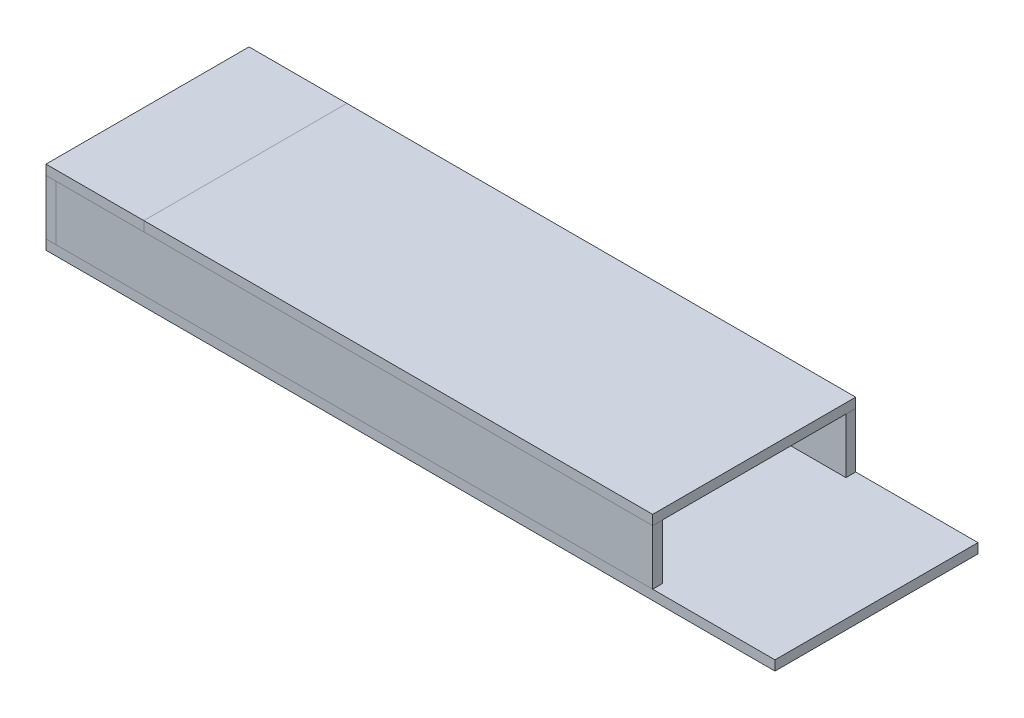
ISO-10303-21;
HEADER;
FILE_DESCRIPTION(('STEP AP214'),'2;1');
FILE_NAME('part.step','',(''),(''),'','','');
FILE_SCHEMA(('AUTOMOTIVE_DESIGN { 1 0 10303 214 1 1 1 1 }'));
ENDSEC;
DATA;
#1=APPLICATION_CONTEXT('core data for automotive mechanical design processes');
#2=APPLICATION_PROTOCOL_DEFINITION('international standard','automotive_design',2000,#1);
#3=PRODUCT_CONTEXT('',#1,'mechanical');
#4=PRODUCT('Part','Part','',(#3));
#5=PRODUCT_RELATED_PRODUCT_CATEGORY('part','',(#4));
#6=PRODUCT_DEFINITION_FORMATION('','',#4);
#7=PRODUCT_DEFINITION_CONTEXT('part definition',#1,'design');
#8=PRODUCT_DEFINITION('design','',#6,#7);
#9=PRODUCT_DEFINITION_SHAPE('','',#8);
#10=(LENGTH_UNIT() NAMED_UNIT(*) SI_UNIT(.MILLI.,.METRE.));
#11=(NAMED_UNIT(*) PLANE_ANGLE_UNIT() SI_UNIT($,.RADIAN.));
#12=(NAMED_UNIT(*) SI_UNIT($,.STERADIAN.) SOLID_ANGLE_UNIT());
#13=UNCERTAINTY_MEASURE_WITH_UNIT(LENGTH_MEASURE(1.E-05),#10,'distance_accuracy_value','');
#14=(GEOMETRIC_REPRESENTATION_CONTEXT(3) GLOBAL_UNCERTAINTY_ASSIGNED_CONTEXT((#13)) GLOBAL_UNIT_ASSIGNED_CONTEXT((#10,
#11,#12)) REPRESENTATION_CONTEXT('',''));
#15=CARTESIAN_POINT('',(0.,0.,0.));
#16=DIRECTION('',(0.,0.,1.));
#17=DIRECTION('',(1.,0.,0.));
#18=AXIS2_PLACEMENT_3D('',#15,#16,#17);
#19=CARTESIAN_POINT('',(-208.,61.,-82.9999999999999));
#20=DIRECTION('',(1.,0.,0.));
#21=DIRECTION('',(0.,0.,-1.));
#22=AXIS2_PLACEMENT_3D('',#19,#20,#21);
#23=PLANE('',#22);
#24=DIRECTION('',(0.,0.,1.));
#25=VECTOR('',#24,1.);
#26=CARTESIAN_POINT('',(-208.,53.,-82.9999999999999));
#27=LINE('',#26,#25);
#28=CARTESIAN_POINT('',(-208.,53.,-82.9999999999999));
#29=VERTEX_POINT('',#28);
#30=CARTESIAN_POINT('',(-208.,53.,83.));
#31=VERTEX_POINT('',#30);
#32=EDGE_CURVE('E116',#29,#31,#27,.T.);
#33=ORIENTED_EDGE('',*,*,#32,.T.);
#34=DIRECTION('',(0.,-1.,0.));
#35=VECTOR('',#34,1.);
#36=CARTESIAN_POINT('',(-208.,61.,83.));
#37=LINE('',#36,#35);
#38=CARTESIAN_POINT('',(-208.,61.,83.));
#39=VERTEX_POINT('',#38);
#40=EDGE_CURVE('E12',#39,#31,#37,.T.);
#41=ORIENTED_EDGE('',*,*,#40,.F.);
#42=DIRECTION('',(0.,0.,1.));
#43=VECTOR('',#42,1.);
#44=CARTESIAN_POINT('',(-208.,61.,-82.9999999999999));
#45=LINE('',#44,#43);
#46=CARTESIAN_POINT('',(-208.,61.,-82.9999999999999));
#47=VERTEX_POINT('',#46);
#48=EDGE_CURVE('E104',#47,#39,#45,.T.);
#49=ORIENTED_EDGE('',*,*,#48,.F.);
#50=DIRECTION('',(0.,-1.,0.));
#51=VECTOR('',#50,1.);
#52=CARTESIAN_POINT('',(-208.,61.,-82.9999999999999));
#53=LINE('',#52,#51);
#54=EDGE_CURVE('E112',#47,#29,#53,.T.);
#55=ORIENTED_EDGE('',*,*,#54,.T.);
#56=EDGE_LOOP('',(#33,#41,#49,#55));
#57=FACE_BOUND('',#56,.T.);
#58=ADVANCED_FACE('F53',(#57),#23,.F.);
#59=CARTESIAN_POINT('',(-208.,61.,83.));
#60=DIRECTION('',(0.,0.,-1.));
#61=DIRECTION('',(-1.,0.,0.));
#62=AXIS2_PLACEMENT_3D('',#59,#60,#61);
#63=PLANE('',#62);
#64=DIRECTION('',(1.,0.,0.));
#65=VECTOR('',#64,1.);
#66=CARTESIAN_POINT('',(-208.,53.,83.));
#67=LINE('',#66,#65);
#68=CARTESIAN_POINT('',(208.,53.,83.));
#69=VERTEX_POINT('',#68);
#70=EDGE_CURVE('E108',#31,#69,#67,.T.);
#71=ORIENTED_EDGE('',*,*,#70,.T.);
#72=DIRECTION('',(0.,-1.,0.));
#73=VECTOR('',#72,1.);
#74=CARTESIAN_POINT('',(208.,61.,83.));
#75=LINE('',#74,#73);
#76=CARTESIAN_POINT('',(208.,61.,83.));
#77=VERTEX_POINT('',#76);
#78=EDGE_CURVE('E61',#77,#69,#75,.T.);
#79=ORIENTED_EDGE('',*,*,#78,.F.);
#80=DIRECTION('',(1.,0.,0.));
#81=VECTOR('',#80,1.);
#82=CARTESIAN_POINT('',(-208.,61.,83.));
#83=LINE('',#82,#81);
#84=EDGE_CURVE('E99',#39,#77,#83,.T.);
#85=ORIENTED_EDGE('',*,*,#84,.F.);
#86=ORIENTED_EDGE('',*,*,#40,.T.);
#87=EDGE_LOOP('',(#71,#79,#85,#86));
#88=FACE_BOUND('',#87,.T.);
#89=ADVANCED_FACE('F107',(#88),#63,.F.);
#90=CARTESIAN_POINT('',(208.,61.,-82.9999999999999));
#91=DIRECTION('',(-1.,0.,0.));
#92=DIRECTION('',(0.,0.,1.));
#93=AXIS2_PLACEMENT_3D('',#90,#91,#92);
#94=PLANE('',#93);
#95=DIRECTION('',(0.,0.,-1.));
#96=VECTOR('',#95,1.);
#97=CARTESIAN_POINT('',(208.,53.,-82.9999999999999));
#98=LINE('',#97,#96);
#99=CARTESIAN_POINT('',(208.,53.,-82.9999999999999));
#100=VERTEX_POINT('',#99);
#101=EDGE_CURVE('E86',#69,#100,#98,.T.);
#102=ORIENTED_EDGE('',*,*,#101,.T.);
#103=DIRECTION('',(0.,-1.,0.));
#104=VECTOR('',#103,1.);
#105=CARTESIAN_POINT('',(208.,61.,-82.9999999999999));
#106=LINE('',#105,#104);
#107=CARTESIAN_POINT('',(208.,61.,-82.9999999999999));
#108=VERTEX_POINT('',#107);
#109=EDGE_CURVE('E109',#108,#100,#106,.T.);
#110=ORIENTED_EDGE('',*,*,#109,.F.);
#111=DIRECTION('',(0.,0.,-1.));
#112=VECTOR('',#111,1.);
#113=CARTESIAN_POINT('',(208.,61.,-82.9999999999999));
#114=LINE('',#113,#112);
#115=EDGE_CURVE('E102',#77,#108,#114,.T.);
#116=ORIENTED_EDGE('',*,*,#115,.F.);
#117=ORIENTED_EDGE('',*,*,#78,.T.);
#118=EDGE_LOOP('',(#102,#110,#116,#117));
#119=FACE_BOUND('',#118,.T.);
#120=ADVANCED_FACE('F110',(#119),#94,.F.);
#121=CARTESIAN_POINT('',(-208.,61.,-82.9999999999999));
#122=DIRECTION('',(0.,0.,1.));
#123=DIRECTION('',(1.,0.,0.));
#124=AXIS2_PLACEMENT_3D('',#121,#122,#123);
#125=PLANE('',#124);
#126=DIRECTION('',(-1.,0.,0.));
#127=VECTOR('',#126,1.);
#128=CARTESIAN_POINT('',(-208.,53.,-82.9999999999999));
#129=LINE('',#128,#127);
#130=EDGE_CURVE('E92',#100,#29,#129,.T.);
#131=ORIENTED_EDGE('',*,*,#130,.T.);
#132=ORIENTED_EDGE('',*,*,#54,.F.);
#133=DIRECTION('',(-1.,0.,0.));
#134=VECTOR('',#133,1.);
#135=CARTESIAN_POINT('',(-208.,61.,-82.9999999999999));
#136=LINE('',#135,#134);
#137=EDGE_CURVE('E69',#108,#47,#136,.T.);
#138=ORIENTED_EDGE('',*,*,#137,.F.);
#139=ORIENTED_EDGE('',*,*,#109,.T.);
#140=EDGE_LOOP('',(#131,#132,#138,#139));
#141=FACE_BOUND('',#140,.T.);
#142=ADVANCED_FACE('F123',(#141),#125,.F.);
#143=CARTESIAN_POINT('',(0.,61.,0.));
#144=DIRECTION('',(0.,1.,0.));
#145=DIRECTION('',(0.,0.,1.));
#146=AXIS2_PLACEMENT_3D('',#143,#144,#145);
#147=PLANE('',#146);
#148=ORIENTED_EDGE('',*,*,#48,.T.);
#149=ORIENTED_EDGE('',*,*,#84,.T.);
#150=ORIENTED_EDGE('',*,*,#115,.T.);
#151=ORIENTED_EDGE('',*,*,#137,.T.);
#152=EDGE_LOOP('',(#148,#149,#150,#151));
#153=FACE_BOUND('',#152,.T.);
#154=ADVANCED_FACE('F100',(#153),#147,.T.);
#155=CARTESIAN_POINT('',(0.,53.,0.));
#156=DIRECTION('',(0.,1.,0.));
#157=DIRECTION('',(0.,0.,1.));
#158=AXIS2_PLACEMENT_3D('',#155,#156,#157);
#159=PLANE('',#158);
#160=ORIENTED_EDGE('',*,*,#32,.F.);
#161=ORIENTED_EDGE('',*,*,#130,.F.);
#162=ORIENTED_EDGE('',*,*,#101,.F.);
#163=ORIENTED_EDGE('',*,*,#70,.F.);
#164=EDGE_LOOP('',(#160,#161,#162,#163));
#165=FACE_BOUND('',#164,.T.);
#166=ADVANCED_FACE('F126',(#165),#159,.F.);
#167=CLOSED_SHELL('',(#58,#89,#120,#142,#154,#166));
#168=MANIFOLD_SOLID_BREP('B2',#167);
#169=CARTESIAN_POINT('',(-288.,61.,-82.9999999999999));
#170=DIRECTION('',(1.,0.,0.));
#171=DIRECTION('',(0.,0.,-1.));
#172=AXIS2_PLACEMENT_3D('',#169,#170,#171);
#173=PLANE('',#172);
#174=DIRECTION('',(0.,0.,1.));
#175=VECTOR('',#174,1.);
#176=CARTESIAN_POINT('',(-288.,53.,-82.9999999999999));
#177=LINE('',#176,#175);
#178=CARTESIAN_POINT('',(-288.,53.,-82.9999999999999));
#179=VERTEX_POINT('',#178);
#180=CARTESIAN_POINT('',(-288.,53.,83.));
#181=VERTEX_POINT('',#180);
#182=EDGE_CURVE('E249',#179,#181,#177,.T.);
#183=ORIENTED_EDGE('',*,*,#182,.T.);
#184=DIRECTION('',(0.,-1.,0.));
#185=VECTOR('',#184,1.);
#186=CARTESIAN_POINT('',(-288.,61.,83.));
#187=LINE('',#186,#185);
#188=CARTESIAN_POINT('',(-288.,61.,83.));
#189=VERTEX_POINT('',#188);
#190=EDGE_CURVE('E51',#189,#181,#187,.T.);
#191=ORIENTED_EDGE('',*,*,#190,.F.);
#192=DIRECTION('',(0.,0.,1.));
#193=VECTOR('',#192,1.);
#194=CARTESIAN_POINT('',(-288.,61.,-82.9999999999999));
#195=LINE('',#194,#193);
#196=CARTESIAN_POINT('',(-288.,61.,-82.9999999999999));
#197=VERTEX_POINT('',#196);
#198=EDGE_CURVE('E237',#197,#189,#195,.T.);
#199=ORIENTED_EDGE('',*,*,#198,.F.);
#200=DIRECTION('',(0.,-1.,0.));
#201=VECTOR('',#200,1.);
#202=CARTESIAN_POINT('',(-288.,61.,-82.9999999999999));
#203=LINE('',#202,#201);
#204=EDGE_CURVE('E245',#197,#179,#203,.T.);
#205=ORIENTED_EDGE('',*,*,#204,.T.);
#206=EDGE_LOOP('',(#183,#191,#199,#205));
#207=FACE_BOUND('',#206,.T.);
#208=ADVANCED_FACE('F186',(#207),#173,.F.);
#209=CARTESIAN_POINT('',(-288.,61.,83.));
#210=DIRECTION('',(0.,0.,-1.));
#211=DIRECTION('',(-1.,0.,0.));
#212=AXIS2_PLACEMENT_3D('',#209,#210,#211);
#213=PLANE('',#212);
#214=DIRECTION('',(1.,0.,0.));
#215=VECTOR('',#214,1.);
#216=CARTESIAN_POINT('',(-288.,53.,83.));
#217=LINE('',#216,#215);
#218=CARTESIAN_POINT('',(-208.,53.,83.0000000000001));
#219=VERTEX_POINT('',#218);
#220=EDGE_CURVE('E241',#181,#219,#217,.T.);
#221=ORIENTED_EDGE('',*,*,#220,.T.);
#222=DIRECTION('',(0.,-1.,0.));
#223=VECTOR('',#222,1.);
#224=CARTESIAN_POINT('',(-208.,61.,83.0000000000001));
#225=LINE('',#224,#223);
#226=CARTESIAN_POINT('',(-208.,61.,83.0000000000001));
#227=VERTEX_POINT('',#226);
#228=EDGE_CURVE('E194',#227,#219,#225,.T.);
#229=ORIENTED_EDGE('',*,*,#228,.F.);
#230=DIRECTION('',(1.,0.,0.));
#231=VECTOR('',#230,1.);
#232=CARTESIAN_POINT('',(-288.,61.,83.));
#233=LINE('',#232,#231);
#234=EDGE_CURVE('E232',#189,#227,#233,.T.);
#235=ORIENTED_EDGE('',*,*,#234,.F.);
#236=ORIENTED_EDGE('',*,*,#190,.T.);
#237=EDGE_LOOP('',(#221,#229,#235,#236));
#238=FACE_BOUND('',#237,.T.);
#239=ADVANCED_FACE('F240',(#238),#213,.F.);
#240=CARTESIAN_POINT('',(-208.,61.,-82.9999999999999));
#241=DIRECTION('',(-1.,0.,0.));
#242=DIRECTION('',(0.,0.,1.));
#243=AXIS2_PLACEMENT_3D('',#240,#241,#242);
#244=PLANE('',#243);
#245=DIRECTION('',(0.,0.,-1.));
#246=VECTOR('',#245,1.);
#247=CARTESIAN_POINT('',(-208.,53.,-82.9999999999999));
#248=LINE('',#247,#246);
#249=CARTESIAN_POINT('',(-208.,53.,-82.9999999999999));
#250=VERTEX_POINT('',#249);
#251=EDGE_CURVE('E219',#219,#250,#248,.T.);
#252=ORIENTED_EDGE('',*,*,#251,.T.);
#253=DIRECTION('',(0.,-1.,0.));
#254=VECTOR('',#253,1.);
#255=CARTESIAN_POINT('',(-208.,61.,-82.9999999999999));
#256=LINE('',#255,#254);
#257=CARTESIAN_POINT('',(-208.,61.,-82.9999999999999));
#258=VERTEX_POINT('',#257);
#259=EDGE_CURVE('E242',#258,#250,#256,.T.);
#260=ORIENTED_EDGE('',*,*,#259,.F.);
#261=DIRECTION('',(0.,0.,-1.));
#262=VECTOR('',#261,1.);
#263=CARTESIAN_POINT('',(-208.,61.,-82.9999999999999));
#264=LINE('',#263,#262);
#265=EDGE_CURVE('E235',#227,#258,#264,.T.);
#266=ORIENTED_EDGE('',*,*,#265,.F.);
#267=ORIENTED_EDGE('',*,*,#228,.T.);
#268=EDGE_LOOP('',(#252,#260,#266,#267));
#269=FACE_BOUND('',#268,.T.);
#270=ADVANCED_FACE('F243',(#269),#244,.F.);
#271=CARTESIAN_POINT('',(-288.,61.,-82.9999999999999));
#272=DIRECTION('',(0.,0.,1.));
#273=DIRECTION('',(1.,0.,0.));
#274=AXIS2_PLACEMENT_3D('',#271,#272,#273);
#275=PLANE('',#274);
#276=DIRECTION('',(-1.,0.,0.));
#277=VECTOR('',#276,1.);
#278=CARTESIAN_POINT('',(-288.,53.,-82.9999999999999));
#279=LINE('',#278,#277);
#280=EDGE_CURVE('E225',#250,#179,#279,.T.);
#281=ORIENTED_EDGE('',*,*,#280,.T.);
#282=ORIENTED_EDGE('',*,*,#204,.F.);
#283=DIRECTION('',(-1.,0.,0.));
#284=VECTOR('',#283,1.);
#285=CARTESIAN_POINT('',(-288.,61.,-82.9999999999999));
#286=LINE('',#285,#284);
#287=EDGE_CURVE('E202',#258,#197,#286,.T.);
#288=ORIENTED_EDGE('',*,*,#287,.F.);
#289=ORIENTED_EDGE('',*,*,#259,.T.);
#290=EDGE_LOOP('',(#281,#282,#288,#289));
#291=FACE_BOUND('',#290,.T.);
#292=ADVANCED_FACE('F256',(#291),#275,.F.);
#293=CARTESIAN_POINT('',(0.,61.,0.));
#294=DIRECTION('',(0.,1.,0.));
#295=DIRECTION('',(0.,0.,1.));
#296=AXIS2_PLACEMENT_3D('',#293,#294,#295);
#297=PLANE('',#296);
#298=ORIENTED_EDGE('',*,*,#198,.T.);
#299=ORIENTED_EDGE('',*,*,#234,.T.);
#300=ORIENTED_EDGE('',*,*,#265,.T.);
#301=ORIENTED_EDGE('',*,*,#287,.T.);
#302=EDGE_LOOP('',(#298,#299,#300,#301));
#303=FACE_BOUND('',#302,.T.);
#304=ADVANCED_FACE('F233',(#303),#297,.T.);
#305=CARTESIAN_POINT('',(0.,53.,0.));
#306=DIRECTION('',(0.,1.,0.));
#307=DIRECTION('',(0.,0.,1.));
#308=AXIS2_PLACEMENT_3D('',#305,#306,#307);
#309=PLANE('',#308);
#310=ORIENTED_EDGE('',*,*,#182,.F.);
#311=ORIENTED_EDGE('',*,*,#280,.F.);
#312=ORIENTED_EDGE('',*,*,#251,.F.);
#313=ORIENTED_EDGE('',*,*,#220,.F.);
#314=EDGE_LOOP('',(#310,#311,#312,#313));
#315=FACE_BOUND('',#314,.T.);
#316=ADVANCED_FACE('F259',(#315),#309,.F.);
#317=CLOSED_SHELL('',(#208,#239,#270,#292,#304,#316));
#318=MANIFOLD_SOLID_BREP('B6',#317);
#319=CARTESIAN_POINT('',(-280.,53.,75.));
#320=DIRECTION('',(1.,0.,0.));
#321=DIRECTION('',(0.,0.,-1.));
#322=AXIS2_PLACEMENT_3D('',#319,#320,#321);
#323=PLANE('',#322);
#324=DIRECTION('',(0.,0.,-1.));
#325=VECTOR('',#324,1.);
#326=CARTESIAN_POINT('',(-280.,53.,0.));
#327=LINE('',#326,#325);
#328=CARTESIAN_POINT('',(-280.,53.,-75.));
#329=VERTEX_POINT('',#328);
#330=CARTESIAN_POINT('',(-280.,53.,-82.9999999999999));
#331=VERTEX_POINT('',#330);
#332=EDGE_CURVE('E184',#329,#331,#327,.T.);
#333=ORIENTED_EDGE('',*,*,#332,.T.);
#334=DIRECTION('',(0.,1.,0.));
#335=VECTOR('',#334,1.);
#336=CARTESIAN_POINT('',(-280.,237.271538768199,-82.9999999999999));
#337=LINE('',#336,#335);
#338=CARTESIAN_POINT('',(-280.,8.,-82.9999999999999));
#339=VERTEX_POINT('',#338);
#340=EDGE_CURVE('E327',#339,#331,#337,.T.);
#341=ORIENTED_EDGE('',*,*,#340,.F.);
#342=DIRECTION('',(0.,0.,-1.));
#343=VECTOR('',#342,1.);
#344=CARTESIAN_POINT('',(-280.,8.,0.));
#345=LINE('',#344,#343);
#346=CARTESIAN_POINT('',(-280.,8.,-75.));
#347=VERTEX_POINT('',#346);
#348=EDGE_CURVE('E322',#347,#339,#345,.T.);
#349=ORIENTED_EDGE('',*,*,#348,.F.);
#350=DIRECTION('',(0.,-1.,0.));
#351=VECTOR('',#350,1.);
#352=CARTESIAN_POINT('',(-280.,237.271538768199,-75.));
#353=LINE('',#352,#351);
#354=EDGE_CURVE('E381',#329,#347,#353,.T.);
#355=ORIENTED_EDGE('',*,*,#354,.F.);
#356=EDGE_LOOP('',(#333,#341,#349,#355));
#357=FACE_BOUND('',#356,.T.);
#358=ADVANCED_FACE('F319',(#357),#323,.F.);
#359=CARTESIAN_POINT('',(-288.,237.271538768199,-82.9999999999999));
#360=DIRECTION('',(0.,0.,1.));
#361=DIRECTION('',(1.,0.,0.));
#362=AXIS2_PLACEMENT_3D('',#359,#360,#361);
#363=PLANE('',#362);
#364=DIRECTION('',(-1.,0.,0.));
#365=VECTOR('',#364,1.);
#366=CARTESIAN_POINT('',(-288.,8.,-82.9999999999999));
#367=LINE('',#366,#365);
#368=CARTESIAN_POINT('',(208.,8.,-83.));
#369=VERTEX_POINT('',#368);
#370=EDGE_CURVE('E367',#369,#339,#367,.T.);
#371=ORIENTED_EDGE('',*,*,#370,.T.);
#372=ORIENTED_EDGE('',*,*,#340,.T.);
#373=DIRECTION('',(-1.,0.,0.));
#374=VECTOR('',#373,1.);
#375=CARTESIAN_POINT('',(-288.,53.,-82.9999999999999));
#376=LINE('',#375,#374);
#377=CARTESIAN_POINT('',(208.,53.,-83.));
#378=VERTEX_POINT('',#377);
#379=EDGE_CURVE('E358',#378,#331,#376,.T.);
#380=ORIENTED_EDGE('',*,*,#379,.F.);
#381=DIRECTION('',(0.,-1.,0.));
#382=VECTOR('',#381,1.);
#383=CARTESIAN_POINT('',(208.,53.,-83.));
#384=LINE('',#383,#382);
#385=EDGE_CURVE('E362',#378,#369,#384,.T.);
#386=ORIENTED_EDGE('',*,*,#385,.T.);
#387=EDGE_LOOP('',(#371,#372,#380,#386));
#388=FACE_BOUND('',#387,.T.);
#389=ADVANCED_FACE('F360',(#388),#363,.F.);
#390=CARTESIAN_POINT('',(-280.,237.271538768199,-75.));
#391=DIRECTION('',(0.,0.,-1.));
#392=DIRECTION('',(-1.,0.,0.));
#393=AXIS2_PLACEMENT_3D('',#390,#391,#392);
#394=PLANE('',#393);
#395=DIRECTION('',(1.,0.,0.));
#396=VECTOR('',#395,1.);
#397=CARTESIAN_POINT('',(-280.,53.,-75.));
#398=LINE('',#397,#396);
#399=CARTESIAN_POINT('',(208.,53.,-75.));
#400=VERTEX_POINT('',#399);
#401=EDGE_CURVE('E366',#329,#400,#398,.T.);
#402=ORIENTED_EDGE('',*,*,#401,.F.);
#403=ORIENTED_EDGE('',*,*,#354,.T.);
#404=DIRECTION('',(1.,0.,0.));
#405=VECTOR('',#404,1.);
#406=CARTESIAN_POINT('',(-280.,8.,-75.));
#407=LINE('',#406,#405);
#408=CARTESIAN_POINT('',(208.,8.,-75.));
#409=VERTEX_POINT('',#408);
#410=EDGE_CURVE('E383',#347,#409,#407,.T.);
#411=ORIENTED_EDGE('',*,*,#410,.T.);
#412=DIRECTION('',(0.,-1.,0.));
#413=VECTOR('',#412,1.);
#414=CARTESIAN_POINT('',(208.,53.,-75.));
#415=LINE('',#414,#413);
#416=EDGE_CURVE('E376',#400,#409,#415,.T.);
#417=ORIENTED_EDGE('',*,*,#416,.F.);
#418=EDGE_LOOP('',(#402,#403,#411,#417));
#419=FACE_BOUND('',#418,.T.);
#420=ADVANCED_FACE('F391',(#419),#394,.F.);
#421=CARTESIAN_POINT('',(0.,53.,0.));
#422=DIRECTION('',(0.,1.,0.));
#423=DIRECTION('',(0.,0.,1.));
#424=AXIS2_PLACEMENT_3D('',#421,#422,#423);
#425=PLANE('',#424);
#426=ORIENTED_EDGE('',*,*,#332,.F.);
#427=ORIENTED_EDGE('',*,*,#401,.T.);
#428=DIRECTION('',(0.,0.,-1.));
#429=VECTOR('',#428,1.);
#430=CARTESIAN_POINT('',(208.,53.,-83.));
#431=LINE('',#430,#429);
#432=EDGE_CURVE('E370',#400,#378,#431,.T.);
#433=ORIENTED_EDGE('',*,*,#432,.T.);
#434=ORIENTED_EDGE('',*,*,#379,.T.);
#435=EDGE_LOOP('',(#426,#427,#433,#434));
#436=FACE_BOUND('',#435,.T.);
#437=ADVANCED_FACE('F371',(#436),#425,.T.);
#438=CARTESIAN_POINT('',(0.,8.,0.));
#439=DIRECTION('',(0.,1.,0.));
#440=DIRECTION('',(0.,0.,1.));
#441=AXIS2_PLACEMENT_3D('',#438,#439,#440);
#442=PLANE('',#441);
#443=ORIENTED_EDGE('',*,*,#410,.F.);
#444=ORIENTED_EDGE('',*,*,#348,.T.);
#445=ORIENTED_EDGE('',*,*,#370,.F.);
#446=DIRECTION('',(0.,0.,-1.));
#447=VECTOR('',#446,1.);
#448=CARTESIAN_POINT('',(208.,8.,-83.));
#449=LINE('',#448,#447);
#450=EDGE_CURVE('E377',#409,#369,#449,.T.);
#451=ORIENTED_EDGE('',*,*,#450,.F.);
#452=EDGE_LOOP('',(#443,#444,#445,#451));
#453=FACE_BOUND('',#452,.T.);
#454=ADVANCED_FACE('F392',(#453),#442,.F.);
#455=CARTESIAN_POINT('',(208.,53.,-83.));
#456=DIRECTION('',(-1.,0.,0.));
#457=DIRECTION('',(0.,0.,1.));
#458=AXIS2_PLACEMENT_3D('',#455,#456,#457);
#459=PLANE('',#458);
#460=ORIENTED_EDGE('',*,*,#450,.T.);
#461=ORIENTED_EDGE('',*,*,#385,.F.);
#462=ORIENTED_EDGE('',*,*,#432,.F.);
#463=ORIENTED_EDGE('',*,*,#416,.T.);
#464=EDGE_LOOP('',(#460,#461,#462,#463));
#465=FACE_BOUND('',#464,.T.);
#466=ADVANCED_FACE('F379',(#465),#459,.F.);
#467=CLOSED_SHELL('',(#358,#389,#420,#437,#454,#466));
#468=MANIFOLD_SOLID_BREP('B45',#467);
#469=CARTESIAN_POINT('',(-280.,53.,75.));
#470=DIRECTION('',(1.,0.,0.));
#471=DIRECTION('',(0.,0.,-1.));
#472=AXIS2_PLACEMENT_3D('',#469,#470,#471);
#473=PLANE('',#472);
#474=DIRECTION('',(0.,-1.,0.));
#475=VECTOR('',#474,1.);
#476=CARTESIAN_POINT('',(-280.,237.271538768199,75.));
#477=LINE('',#476,#475);
#478=CARTESIAN_POINT('',(-280.,53.,75.));
#479=VERTEX_POINT('',#478);
#480=CARTESIAN_POINT('',(-280.,8.,75.));
#481=VERTEX_POINT('',#480);
#482=EDGE_CURVE('E473',#479,#481,#477,.T.);
#483=ORIENTED_EDGE('',*,*,#482,.T.);
#484=DIRECTION('',(0.,0.,-1.));
#485=VECTOR('',#484,1.);
#486=CARTESIAN_POINT('',(-280.,8.,0.));
#487=LINE('',#486,#485);
#488=CARTESIAN_POINT('',(-280.,8.,83.0000000000001));
#489=VERTEX_POINT('',#488);
#490=EDGE_CURVE('E520',#489,#481,#487,.T.);
#491=ORIENTED_EDGE('',*,*,#490,.F.);
#492=DIRECTION('',(0.,-1.,0.));
#493=VECTOR('',#492,1.);
#494=CARTESIAN_POINT('',(-280.,237.271538768199,83.0000000000001));
#495=LINE('',#494,#493);
#496=CARTESIAN_POINT('',(-280.,53.,83.0000000000001));
#497=VERTEX_POINT('',#496);
#498=EDGE_CURVE('E485',#497,#489,#495,.T.);
#499=ORIENTED_EDGE('',*,*,#498,.F.);
#500=DIRECTION('',(0.,0.,-1.));
#501=VECTOR('',#500,1.);
#502=CARTESIAN_POINT('',(-280.,53.,0.));
#503=LINE('',#502,#501);
#504=EDGE_CURVE('E493',#497,#479,#503,.T.);
#505=ORIENTED_EDGE('',*,*,#504,.T.);
#506=EDGE_LOOP('',(#483,#491,#499,#505));
#507=FACE_BOUND('',#506,.T.);
#508=ADVANCED_FACE('F469',(#507),#473,.F.);
#509=CARTESIAN_POINT('',(0.,8.,0.));
#510=DIRECTION('',(0.,1.,0.));
#511=DIRECTION('',(0.,0.,1.));
#512=AXIS2_PLACEMENT_3D('',#509,#510,#511);
#513=PLANE('',#512);
#514=DIRECTION('',(1.,0.,0.));
#515=VECTOR('',#514,1.);
#516=CARTESIAN_POINT('',(-288.,8.,83.0000000000001));
#517=LINE('',#516,#515);
#518=CARTESIAN_POINT('',(208.,8.,83.));
#519=VERTEX_POINT('',#518);
#520=EDGE_CURVE('E317',#489,#519,#517,.T.);
#521=ORIENTED_EDGE('',*,*,#520,.F.);
#522=ORIENTED_EDGE('',*,*,#490,.T.);
#523=DIRECTION('',(-1.,0.,0.));
#524=VECTOR('',#523,1.);
#525=CARTESIAN_POINT('',(-280.,8.,75.));
#526=LINE('',#525,#524);
#527=CARTESIAN_POINT('',(208.,8.,75.));
#528=VERTEX_POINT('',#527);
#529=EDGE_CURVE('E478',#528,#481,#526,.T.);
#530=ORIENTED_EDGE('',*,*,#529,.F.);
#531=DIRECTION('',(0.,0.,-1.));
#532=VECTOR('',#531,1.);
#533=CARTESIAN_POINT('',(208.,8.,83.));
#534=LINE('',#533,#532);
#535=EDGE_CURVE('E528',#519,#528,#534,.T.);
#536=ORIENTED_EDGE('',*,*,#535,.F.);
#537=EDGE_LOOP('',(#521,#522,#530,#536));
#538=FACE_BOUND('',#537,.T.);
#539=ADVANCED_FACE('F543',(#538),#513,.F.);
#540=CARTESIAN_POINT('',(0.,53.,0.));
#541=DIRECTION('',(0.,1.,0.));
#542=DIRECTION('',(0.,0.,1.));
#543=AXIS2_PLACEMENT_3D('',#540,#541,#542);
#544=PLANE('',#543);
#545=ORIENTED_EDGE('',*,*,#504,.F.);
#546=DIRECTION('',(1.,0.,0.));
#547=VECTOR('',#546,1.);
#548=CARTESIAN_POINT('',(-288.,53.,83.0000000000001));
#549=LINE('',#548,#547);
#550=CARTESIAN_POINT('',(208.,53.,83.));
#551=VERTEX_POINT('',#550);
#552=EDGE_CURVE('E519',#497,#551,#549,.T.);
#553=ORIENTED_EDGE('',*,*,#552,.T.);
#554=DIRECTION('',(0.,0.,-1.));
#555=VECTOR('',#554,1.);
#556=CARTESIAN_POINT('',(208.,53.,83.));
#557=LINE('',#556,#555);
#558=CARTESIAN_POINT('',(208.,53.,75.));
#559=VERTEX_POINT('',#558);
#560=EDGE_CURVE('E523',#551,#559,#557,.T.);
#561=ORIENTED_EDGE('',*,*,#560,.T.);
#562=DIRECTION('',(-1.,0.,0.));
#563=VECTOR('',#562,1.);
#564=CARTESIAN_POINT('',(-280.,53.,75.));
#565=LINE('',#564,#563);
#566=EDGE_CURVE('E511',#559,#479,#565,.T.);
#567=ORIENTED_EDGE('',*,*,#566,.T.);
#568=EDGE_LOOP('',(#545,#553,#561,#567));
#569=FACE_BOUND('',#568,.T.);
#570=ADVANCED_FACE('F471',(#569),#544,.T.);
#571=CARTESIAN_POINT('',(-288.,237.271538768199,83.0000000000001));
#572=DIRECTION('',(0.,0.,-1.));
#573=DIRECTION('',(-1.,0.,0.));
#574=AXIS2_PLACEMENT_3D('',#571,#572,#573);
#575=PLANE('',#574);
#576=ORIENTED_EDGE('',*,*,#552,.F.);
#577=ORIENTED_EDGE('',*,*,#498,.T.);
#578=ORIENTED_EDGE('',*,*,#520,.T.);
#579=DIRECTION('',(0.,-1.,0.));
#580=VECTOR('',#579,1.);
#581=CARTESIAN_POINT('',(208.,53.,83.));
#582=LINE('',#581,#580);
#583=EDGE_CURVE('E527',#551,#519,#582,.T.);
#584=ORIENTED_EDGE('',*,*,#583,.F.);
#585=EDGE_LOOP('',(#576,#577,#578,#584));
#586=FACE_BOUND('',#585,.T.);
#587=ADVANCED_FACE('F541',(#586),#575,.F.);
#588=CARTESIAN_POINT('',(-280.,237.271538768199,75.));
#589=DIRECTION('',(0.,0.,1.));
#590=DIRECTION('',(1.,0.,0.));
#591=AXIS2_PLACEMENT_3D('',#588,#589,#590);
#592=PLANE('',#591);
#593=ORIENTED_EDGE('',*,*,#566,.F.);
#594=DIRECTION('',(0.,-1.,0.));
#595=VECTOR('',#594,1.);
#596=CARTESIAN_POINT('',(208.,53.,75.));
#597=LINE('',#596,#595);
#598=EDGE_CURVE('E516',#559,#528,#597,.T.);
#599=ORIENTED_EDGE('',*,*,#598,.T.);
#600=ORIENTED_EDGE('',*,*,#529,.T.);
#601=ORIENTED_EDGE('',*,*,#482,.F.);
#602=EDGE_LOOP('',(#593,#599,#600,#601));
#603=FACE_BOUND('',#602,.T.);
#604=ADVANCED_FACE('F513',(#603),#592,.F.);
#605=CARTESIAN_POINT('',(208.,53.,83.));
#606=DIRECTION('',(-1.,0.,0.));
#607=DIRECTION('',(0.,0.,1.));
#608=AXIS2_PLACEMENT_3D('',#605,#606,#607);
#609=PLANE('',#608);
#610=ORIENTED_EDGE('',*,*,#535,.T.);
#611=ORIENTED_EDGE('',*,*,#598,.F.);
#612=ORIENTED_EDGE('',*,*,#560,.F.);
#613=ORIENTED_EDGE('',*,*,#583,.T.);
#614=EDGE_LOOP('',(#610,#611,#612,#613));
#615=FACE_BOUND('',#614,.T.);
#616=ADVANCED_FACE('F530',(#615),#609,.F.);
#617=CLOSED_SHELL('',(#508,#539,#570,#587,#604,#616));
#618=MANIFOLD_SOLID_BREP('B178',#617);
#619=CARTESIAN_POINT('',(-280.,53.,75.));
#620=DIRECTION('',(1.,0.,0.));
#621=DIRECTION('',(0.,0.,-1.));
#622=AXIS2_PLACEMENT_3D('',#619,#620,#621);
#623=PLANE('',#622);
#624=DIRECTION('',(0.,-1.,0.));
#625=VECTOR('',#624,1.);
#626=CARTESIAN_POINT('',(-280.,237.271538768199,83.0000000000001));
#627=LINE('',#626,#625);
#628=CARTESIAN_POINT('',(-280.,53.,83.0000000000001));
#629=VERTEX_POINT('',#628);
#630=CARTESIAN_POINT('',(-280.,8.,83.0000000000001));
#631=VERTEX_POINT('',#630);
#632=EDGE_CURVE('E623',#629,#631,#627,.T.);
#633=ORIENTED_EDGE('',*,*,#632,.T.);
#634=DIRECTION('',(0.,0.,-1.));
#635=VECTOR('',#634,1.);
#636=CARTESIAN_POINT('',(-280.,8.,-75.));
#637=LINE('',#636,#635);
#638=CARTESIAN_POINT('',(-280.,8.,-82.9999999999999));
#639=VERTEX_POINT('',#638);
#640=EDGE_CURVE('E659',#631,#639,#637,.T.);
#641=ORIENTED_EDGE('',*,*,#640,.T.);
#642=DIRECTION('',(0.,1.,0.));
#643=VECTOR('',#642,1.);
#644=CARTESIAN_POINT('',(-280.,237.271538768199,-82.9999999999999));
#645=LINE('',#644,#643);
#646=CARTESIAN_POINT('',(-280.,53.,-82.9999999999999));
#647=VERTEX_POINT('',#646);
#648=EDGE_CURVE('E660',#639,#647,#645,.T.);
#649=ORIENTED_EDGE('',*,*,#648,.T.);
#650=DIRECTION('',(0.,0.,-1.));
#651=VECTOR('',#650,1.);
#652=CARTESIAN_POINT('',(-280.,53.,-75.));
#653=LINE('',#652,#651);
#654=EDGE_CURVE('E675',#629,#647,#653,.T.);
#655=ORIENTED_EDGE('',*,*,#654,.F.);
#656=EDGE_LOOP('',(#633,#641,#649,#655));
#657=FACE_BOUND('',#656,.T.);
#658=ADVANCED_FACE('F619',(#657),#623,.T.);
#659=CARTESIAN_POINT('',(-288.,237.271538768199,83.0000000000001));
#660=DIRECTION('',(1.,0.,0.));
#661=DIRECTION('',(0.,0.,-1.));
#662=AXIS2_PLACEMENT_3D('',#659,#660,#661);
#663=PLANE('',#662);
#664=DIRECTION('',(0.,0.,1.));
#665=VECTOR('',#664,1.);
#666=CARTESIAN_POINT('',(-288.,53.,83.0000000000001));
#667=LINE('',#666,#665);
#668=CARTESIAN_POINT('',(-288.,53.,-82.9999999999999));
#669=VERTEX_POINT('',#668);
#670=CARTESIAN_POINT('',(-288.,53.,83.0000000000001));
#671=VERTEX_POINT('',#670);
#672=EDGE_CURVE('E678',#669,#671,#667,.T.);
#673=ORIENTED_EDGE('',*,*,#672,.F.);
#674=DIRECTION('',(0.,-1.,0.));
#675=VECTOR('',#674,1.);
#676=CARTESIAN_POINT('',(-288.,237.271538768199,-82.9999999999999));
#677=LINE('',#676,#675);
#678=CARTESIAN_POINT('',(-288.,8.,-82.9999999999999));
#679=VERTEX_POINT('',#678);
#680=EDGE_CURVE('E467',#669,#679,#677,.T.);
#681=ORIENTED_EDGE('',*,*,#680,.T.);
#682=DIRECTION('',(0.,0.,1.));
#683=VECTOR('',#682,1.);
#684=CARTESIAN_POINT('',(-288.,8.,83.0000000000001));
#685=LINE('',#684,#683);
#686=CARTESIAN_POINT('',(-288.,8.,83.0000000000001));
#687=VERTEX_POINT('',#686);
#688=EDGE_CURVE('E629',#679,#687,#685,.T.);
#689=ORIENTED_EDGE('',*,*,#688,.T.);
#690=DIRECTION('',(0.,-1.,0.));
#691=VECTOR('',#690,1.);
#692=CARTESIAN_POINT('',(-288.,237.271538768199,83.0000000000001));
#693=LINE('',#692,#691);
#694=EDGE_CURVE('E680',#671,#687,#693,.T.);
#695=ORIENTED_EDGE('',*,*,#694,.F.);
#696=EDGE_LOOP('',(#673,#681,#689,#695));
#697=FACE_BOUND('',#696,.T.);
#698=ADVANCED_FACE('F692',(#697),#663,.F.);
#699=CARTESIAN_POINT('',(-288.,237.271538768199,-82.9999999999999));
#700=DIRECTION('',(0.,0.,1.));
#701=DIRECTION('',(1.,0.,0.));
#702=AXIS2_PLACEMENT_3D('',#699,#700,#701);
#703=PLANE('',#702);
#704=ORIENTED_EDGE('',*,*,#648,.F.);
#705=DIRECTION('',(-1.,0.,0.));
#706=VECTOR('',#705,1.);
#707=CARTESIAN_POINT('',(-288.,8.,-82.9999999999999));
#708=LINE('',#707,#706);
#709=EDGE_CURVE('E636',#639,#679,#708,.T.);
#710=ORIENTED_EDGE('',*,*,#709,.T.);
#711=ORIENTED_EDGE('',*,*,#680,.F.);
#712=DIRECTION('',(-1.,0.,0.));
#713=VECTOR('',#712,1.);
#714=CARTESIAN_POINT('',(-288.,53.,-82.9999999999999));
#715=LINE('',#714,#713);
#716=EDGE_CURVE('E671',#647,#669,#715,.T.);
#717=ORIENTED_EDGE('',*,*,#716,.F.);
#718=EDGE_LOOP('',(#704,#710,#711,#717));
#719=FACE_BOUND('',#718,.T.);
#720=ADVANCED_FACE('F673',(#719),#703,.F.);
#721=CARTESIAN_POINT('',(-288.,237.271538768199,83.0000000000001));
#722=DIRECTION('',(0.,0.,-1.));
#723=DIRECTION('',(-1.,0.,0.));
#724=AXIS2_PLACEMENT_3D('',#721,#722,#723);
#725=PLANE('',#724);
#726=ORIENTED_EDGE('',*,*,#632,.F.);
#727=DIRECTION('',(1.,0.,0.));
#728=VECTOR('',#727,1.);
#729=CARTESIAN_POINT('',(-288.,53.,83.0000000000001));
#730=LINE('',#729,#728);
#731=EDGE_CURVE('E681',#671,#629,#730,.T.);
#732=ORIENTED_EDGE('',*,*,#731,.F.);
#733=ORIENTED_EDGE('',*,*,#694,.T.);
#734=DIRECTION('',(1.,0.,0.));
#735=VECTOR('',#734,1.);
#736=CARTESIAN_POINT('',(-288.,8.,83.0000000000001));
#737=LINE('',#736,#735);
#738=EDGE_CURVE('E666',#687,#631,#737,.T.);
#739=ORIENTED_EDGE('',*,*,#738,.T.);
#740=EDGE_LOOP('',(#726,#732,#733,#739));
#741=FACE_BOUND('',#740,.T.);
#742=ADVANCED_FACE('F621',(#741),#725,.F.);
#743=CARTESIAN_POINT('',(0.,53.,0.));
#744=DIRECTION('',(0.,1.,0.));
#745=DIRECTION('',(0.,0.,1.));
#746=AXIS2_PLACEMENT_3D('',#743,#744,#745);
#747=PLANE('',#746);
#748=ORIENTED_EDGE('',*,*,#731,.T.);
#749=ORIENTED_EDGE('',*,*,#654,.T.);
#750=ORIENTED_EDGE('',*,*,#716,.T.);
#751=ORIENTED_EDGE('',*,*,#672,.T.);
#752=EDGE_LOOP('',(#748,#749,#750,#751));
#753=FACE_BOUND('',#752,.T.);
#754=ADVANCED_FACE('F693',(#753),#747,.T.);
#755=CARTESIAN_POINT('',(0.,8.,0.));
#756=DIRECTION('',(0.,1.,0.));
#757=DIRECTION('',(0.,0.,1.));
#758=AXIS2_PLACEMENT_3D('',#755,#756,#757);
#759=PLANE('',#758);
#760=ORIENTED_EDGE('',*,*,#640,.F.);
#761=ORIENTED_EDGE('',*,*,#738,.F.);
#762=ORIENTED_EDGE('',*,*,#688,.F.);
#763=ORIENTED_EDGE('',*,*,#709,.F.);
#764=EDGE_LOOP('',(#760,#761,#762,#763));
#765=FACE_BOUND('',#764,.T.);
#766=ADVANCED_FACE('F669',(#765),#759,.F.);
#767=CLOSED_SHELL('',(#658,#698,#720,#742,#754,#766));
#768=MANIFOLD_SOLID_BREP('B311',#767);
#769=CARTESIAN_POINT('',(-208.,0.,83.));
#770=DIRECTION('',(0.,0.,1.));
#771=DIRECTION('',(1.,0.,0.));
#772=AXIS2_PLACEMENT_3D('',#769,#770,#771);
#773=PLANE('',#772);
#774=DIRECTION('',(1.,0.,0.));
#775=VECTOR('',#774,1.);
#776=CARTESIAN_POINT('',(-208.,8.,83.));
#777=LINE('',#776,#775);
#778=CARTESIAN_POINT('',(-288.,8.,83.0000000000001));
#779=VERTEX_POINT('',#778);
#780=CARTESIAN_POINT('',(308.,8.,83.));
#781=VERTEX_POINT('',#780);
#782=EDGE_CURVE('E795',#779,#781,#777,.T.);
#783=ORIENTED_EDGE('',*,*,#782,.F.);
#784=DIRECTION('',(0.,1.,0.));
#785=VECTOR('',#784,1.);
#786=CARTESIAN_POINT('',(-288.,0.,83.0000000000001));
#787=LINE('',#786,#785);
#788=CARTESIAN_POINT('',(-288.,0.,83.0000000000001));
#789=VERTEX_POINT('',#788);
#790=EDGE_CURVE('E617',#789,#779,#787,.T.);
#791=ORIENTED_EDGE('',*,*,#790,.F.);
#792=DIRECTION('',(1.,0.,0.));
#793=VECTOR('',#792,1.);
#794=CARTESIAN_POINT('',(-208.,0.,83.));
#795=LINE('',#794,#793);
#796=CARTESIAN_POINT('',(308.,0.,83.));
#797=VERTEX_POINT('',#796);
#798=EDGE_CURVE('E805',#789,#797,#795,.T.);
#799=ORIENTED_EDGE('',*,*,#798,.T.);
#800=DIRECTION('',(0.,-1.,0.));
#801=VECTOR('',#800,1.);
#802=CARTESIAN_POINT('',(308.,8.,83.));
#803=LINE('',#802,#801);
#804=EDGE_CURVE('E808',#781,#797,#803,.T.);
#805=ORIENTED_EDGE('',*,*,#804,.F.);
#806=EDGE_LOOP('',(#783,#791,#799,#805));
#807=FACE_BOUND('',#806,.T.);
#808=ADVANCED_FACE('F763',(#807),#773,.T.);
#809=CARTESIAN_POINT('',(-288.,0.,-82.9999999999999));
#810=DIRECTION('',(-1.,0.,0.));
#811=DIRECTION('',(0.,0.,1.));
#812=AXIS2_PLACEMENT_3D('',#809,#810,#811);
#813=PLANE('',#812);
#814=DIRECTION('',(0.,0.,1.));
#815=VECTOR('',#814,1.);
#816=CARTESIAN_POINT('',(-288.,8.,-82.9999999999999));
#817=LINE('',#816,#815);
#818=CARTESIAN_POINT('',(-288.,8.,-82.9999999999999));
#819=VERTEX_POINT('',#818);
#820=EDGE_CURVE('E833',#819,#779,#817,.T.);
#821=ORIENTED_EDGE('',*,*,#820,.F.);
#822=DIRECTION('',(0.,1.,0.));
#823=VECTOR('',#822,1.);
#824=CARTESIAN_POINT('',(-288.,0.,-82.9999999999999));
#825=LINE('',#824,#823);
#826=CARTESIAN_POINT('',(-288.,0.,-82.9999999999999));
#827=VERTEX_POINT('',#826);
#828=EDGE_CURVE('E767',#827,#819,#825,.T.);
#829=ORIENTED_EDGE('',*,*,#828,.F.);
#830=DIRECTION('',(0.,0.,1.));
#831=VECTOR('',#830,1.);
#832=CARTESIAN_POINT('',(-288.,0.,-82.9999999999999));
#833=LINE('',#832,#831);
#834=EDGE_CURVE('E811',#827,#789,#833,.T.);
#835=ORIENTED_EDGE('',*,*,#834,.T.);
#836=ORIENTED_EDGE('',*,*,#790,.T.);
#837=EDGE_LOOP('',(#821,#829,#835,#836));
#838=FACE_BOUND('',#837,.T.);
#839=ADVANCED_FACE('F837',(#838),#813,.T.);
#840=CARTESIAN_POINT('',(-208.,0.,-83.));
#841=DIRECTION('',(0.,0.,-1.));
#842=DIRECTION('',(-1.,0.,0.));
#843=AXIS2_PLACEMENT_3D('',#840,#841,#842);
#844=PLANE('',#843);
#845=DIRECTION('',(-1.,0.,0.));
#846=VECTOR('',#845,1.);
#847=CARTESIAN_POINT('',(-208.,8.,-83.));
#848=LINE('',#847,#846);
#849=CARTESIAN_POINT('',(308.,8.,-83.));
#850=VERTEX_POINT('',#849);
#851=EDGE_CURVE('E828',#850,#819,#848,.T.);
#852=ORIENTED_EDGE('',*,*,#851,.F.);
#853=DIRECTION('',(0.,1.,0.));
#854=VECTOR('',#853,1.);
#855=CARTESIAN_POINT('',(308.,0.,-83.));
#856=LINE('',#855,#854);
#857=CARTESIAN_POINT('',(308.,0.,-83.));
#858=VERTEX_POINT('',#857);
#859=EDGE_CURVE('E820',#858,#850,#856,.T.);
#860=ORIENTED_EDGE('',*,*,#859,.F.);
#861=DIRECTION('',(-1.,0.,0.));
#862=VECTOR('',#861,1.);
#863=CARTESIAN_POINT('',(-208.,0.,-83.));
#864=LINE('',#863,#862);
#865=EDGE_CURVE('E816',#858,#827,#864,.T.);
#866=ORIENTED_EDGE('',*,*,#865,.T.);
#867=ORIENTED_EDGE('',*,*,#828,.T.);
#868=EDGE_LOOP('',(#852,#860,#866,#867));
#869=FACE_BOUND('',#868,.T.);
#870=ADVANCED_FACE('F765',(#869),#844,.T.);
#871=CARTESIAN_POINT('',(0.,0.,0.));
#872=DIRECTION('',(0.,-1.,0.));
#873=DIRECTION('',(0.,0.,-1.));
#874=AXIS2_PLACEMENT_3D('',#871,#872,#873);
#875=PLANE('',#874);
#876=ORIENTED_EDGE('',*,*,#865,.F.);
#877=DIRECTION('',(0.,0.,-1.));
#878=VECTOR('',#877,1.);
#879=CARTESIAN_POINT('',(308.,0.,83.));
#880=LINE('',#879,#878);
#881=EDGE_CURVE('E814',#797,#858,#880,.T.);
#882=ORIENTED_EDGE('',*,*,#881,.F.);
#883=ORIENTED_EDGE('',*,*,#798,.F.);
#884=ORIENTED_EDGE('',*,*,#834,.F.);
#885=EDGE_LOOP('',(#876,#882,#883,#884));
#886=FACE_BOUND('',#885,.T.);
#887=ADVANCED_FACE('F815',(#886),#875,.T.);
#888=CARTESIAN_POINT('',(0.,8.,0.));
#889=DIRECTION('',(0.,-1.,0.));
#890=DIRECTION('',(0.,0.,-1.));
#891=AXIS2_PLACEMENT_3D('',#888,#889,#890);
#892=PLANE('',#891);
#893=ORIENTED_EDGE('',*,*,#782,.T.);
#894=DIRECTION('',(0.,0.,1.));
#895=VECTOR('',#894,1.);
#896=CARTESIAN_POINT('',(308.,8.,-83.));
#897=LINE('',#896,#895);
#898=EDGE_CURVE('E823',#850,#781,#897,.T.);
#899=ORIENTED_EDGE('',*,*,#898,.F.);
#900=ORIENTED_EDGE('',*,*,#851,.T.);
#901=ORIENTED_EDGE('',*,*,#820,.T.);
#902=EDGE_LOOP('',(#893,#899,#900,#901));
#903=FACE_BOUND('',#902,.T.);
#904=ADVANCED_FACE('F835',(#903),#892,.F.);
#905=CARTESIAN_POINT('',(308.,0.,0.));
#906=DIRECTION('',(1.,0.,0.));
#907=DIRECTION('',(0.,0.,-1.));
#908=AXIS2_PLACEMENT_3D('',#905,#906,#907);
#909=PLANE('',#908);
#910=ORIENTED_EDGE('',*,*,#804,.T.);
#911=ORIENTED_EDGE('',*,*,#881,.T.);
#912=ORIENTED_EDGE('',*,*,#859,.T.);
#913=ORIENTED_EDGE('',*,*,#898,.T.);
#914=EDGE_LOOP('',(#910,#911,#912,#913));
#915=FACE_BOUND('',#914,.T.);
#916=ADVANCED_FACE('F822',(#915),#909,.T.);
#917=CLOSED_SHELL('',(#808,#839,#870,#887,#904,#916));
#918=MANIFOLD_SOLID_BREP('B461',#917);
#919=CARTESIAN_POINT('',(0.,8.,0.));
#920=DIRECTION('',(0.,1.,0.));
#921=DIRECTION('',(0.,0.,1.));
#922=AXIS2_PLACEMENT_3D('',#919,#920,#921);
#923=PLANE('',#922);
#924=DIRECTION('',(1.,0.,0.));
#925=VECTOR('',#924,1.);
#926=CARTESIAN_POINT('',(0.,8.,-75.));
#927=LINE('',#926,#925);
#928=CARTESIAN_POINT('',(-208.,8.,-75.));
#929=VERTEX_POINT('',#928);
#930=CARTESIAN_POINT('',(-200.,8.,-75.));
#931=VERTEX_POINT('',#930);
#932=EDGE_CURVE('E1018',#929,#931,#927,.T.);
#933=ORIENTED_EDGE('',*,*,#932,.T.);
#934=DIRECTION('',(0.,0.,-1.));
#935=VECTOR('',#934,1.);
#936=CARTESIAN_POINT('',(-200.,8.,0.));
#937=LINE('',#936,#935);
#938=CARTESIAN_POINT('',(-200.,8.,75.));
#939=VERTEX_POINT('',#938);
#940=EDGE_CURVE('E1034',#939,#931,#937,.T.);
#941=ORIENTED_EDGE('',*,*,#940,.F.);
#942=DIRECTION('',(-1.,0.,0.));
#943=VECTOR('',#942,1.);
#944=CARTESIAN_POINT('',(0.,8.,75.));
#945=LINE('',#944,#943);
#946=CARTESIAN_POINT('',(-208.,8.,75.));
#947=VERTEX_POINT('',#946);
#948=EDGE_CURVE('E1031',#939,#947,#945,.T.);
#949=ORIENTED_EDGE('',*,*,#948,.T.);
#950=DIRECTION('',(0.,0.,1.));
#951=VECTOR('',#950,1.);
#952=CARTESIAN_POINT('',(-208.,8.,0.));
#953=LINE('',#952,#951);
#954=EDGE_CURVE('E1028',#929,#947,#953,.T.);
#955=ORIENTED_EDGE('',*,*,#954,.F.);
#956=EDGE_LOOP('',(#933,#941,#949,#955));
#957=FACE_BOUND('',#956,.T.);
#958=ADVANCED_FACE('F919',(#957),#923,.F.);
#959=CARTESIAN_POINT('',(-200.,203.213181845003,0.));
#960=DIRECTION('',(-1.,0.,0.));
#961=DIRECTION('',(0.,0.,1.));
#962=AXIS2_PLACEMENT_3D('',#959,#960,#961);
#963=PLANE('',#962);
#964=DIRECTION('',(0.,0.,1.));
#965=VECTOR('',#964,1.);
#966=CARTESIAN_POINT('',(-200.,36.3783534538757,5.00000000000001));
#967=LINE('',#966,#965);
#968=CARTESIAN_POINT('',(-200.,36.3783534538757,-4.99999999999999));
#969=VERTEX_POINT('',#968);
#970=CARTESIAN_POINT('',(-200.,36.3783534538757,5.00000000000001));
#971=VERTEX_POINT('',#970);
#972=EDGE_CURVE('E1012',#969,#971,#967,.T.);
#973=ORIENTED_EDGE('',*,*,#972,.F.);
#974=DIRECTION('',(0.,1.,0.));
#975=VECTOR('',#974,1.);
#976=CARTESIAN_POINT('',(-200.,36.3783534538757,-4.99999999999999));
#977=LINE('',#976,#975);
#978=CARTESIAN_POINT('',(-200.,26.3783534538757,-4.99999999999999));
#979=VERTEX_POINT('',#978);
#980=EDGE_CURVE('E936',#979,#969,#977,.T.);
#981=ORIENTED_EDGE('',*,*,#980,.F.);
#982=DIRECTION('',(0.,0.,-1.));
#983=VECTOR('',#982,1.);
#984=CARTESIAN_POINT('',(-200.,26.3783534538757,5.00000000000001));
#985=LINE('',#984,#983);
#986=CARTESIAN_POINT('',(-200.,26.3783534538757,5.00000000000001));
#987=VERTEX_POINT('',#986);
#988=EDGE_CURVE('E1003',#987,#979,#985,.T.);
#989=ORIENTED_EDGE('',*,*,#988,.F.);
#990=DIRECTION('',(0.,-1.,0.));
#991=VECTOR('',#990,1.);
#992=CARTESIAN_POINT('',(-200.,36.3783534538757,5.00000000000001));
#993=LINE('',#992,#991);
#994=EDGE_CURVE('E1006',#971,#987,#993,.T.);
#995=ORIENTED_EDGE('',*,*,#994,.F.);
#996=EDGE_LOOP('',(#973,#981,#989,#995));
#997=FACE_BOUND('',#996,.T.);
#998=DIRECTION('',(0.,-1.,0.));
#999=VECTOR('',#998,1.);
#1000=CARTESIAN_POINT('',(-200.,203.213181845003,-75.));
#1001=LINE('',#1000,#999);
#1002=CARTESIAN_POINT('',(-200.,53.,-75.));
#1003=VERTEX_POINT('',#1002);
#1004=EDGE_CURVE('E1037',#1003,#931,#1001,.T.);
#1005=ORIENTED_EDGE('',*,*,#1004,.F.);
#1006=DIRECTION('',(0.,0.,1.));
#1007=VECTOR('',#1006,1.);
#1008=CARTESIAN_POINT('',(-200.,53.,0.));
#1009=LINE('',#1008,#1007);
#1010=CARTESIAN_POINT('',(-200.,53.,75.));
#1011=VERTEX_POINT('',#1010);
#1012=EDGE_CURVE('E923',#1003,#1011,#1009,.T.);
#1013=ORIENTED_EDGE('',*,*,#1012,.T.);
#1014=DIRECTION('',(0.,-1.,0.));
#1015=VECTOR('',#1014,1.);
#1016=CARTESIAN_POINT('',(-200.,203.213181845003,75.));
#1017=LINE('',#1016,#1015);
#1018=EDGE_CURVE('E1039',#1011,#939,#1017,.T.);
#1019=ORIENTED_EDGE('',*,*,#1018,.T.);
#1020=ORIENTED_EDGE('',*,*,#940,.T.);
#1021=EDGE_LOOP('',(#1005,#1013,#1019,#1020));
#1022=FACE_BOUND('',#1021,.T.);
#1023=ADVANCED_FACE('F1048',(#997,#1022),#963,.F.);
#1024=CARTESIAN_POINT('',(0.,203.213181845003,75.));
#1025=DIRECTION('',(0.,0.,1.));
#1026=DIRECTION('',(1.,0.,0.));
#1027=AXIS2_PLACEMENT_3D('',#1024,#1025,#1026);
#1028=PLANE('',#1027);
#1029=DIRECTION('',(1.,0.,0.));
#1030=VECTOR('',#1029,1.);
#1031=CARTESIAN_POINT('',(0.,53.,75.));
#1032=LINE('',#1031,#1030);
#1033=CARTESIAN_POINT('',(-208.,53.,75.));
#1034=VERTEX_POINT('',#1033);
#1035=EDGE_CURVE('E1022',#1034,#1011,#1032,.T.);
#1036=ORIENTED_EDGE('',*,*,#1035,.F.);
#1037=DIRECTION('',(0.,-1.,0.));
#1038=VECTOR('',#1037,1.);
#1039=CARTESIAN_POINT('',(-208.,203.213181845003,75.));
#1040=LINE('',#1039,#1038);
#1041=EDGE_CURVE('E1041',#1034,#947,#1040,.T.);
#1042=ORIENTED_EDGE('',*,*,#1041,.T.);
#1043=ORIENTED_EDGE('',*,*,#948,.F.);
#1044=ORIENTED_EDGE('',*,*,#1018,.F.);
#1045=EDGE_LOOP('',(#1036,#1042,#1043,#1044));
#1046=FACE_BOUND('',#1045,.T.);
#1047=ADVANCED_FACE('F1060',(#1046),#1028,.T.);
#1048=CARTESIAN_POINT('',(-208.,203.213181845003,0.));
#1049=DIRECTION('',(1.,0.,0.));
#1050=DIRECTION('',(0.,0.,-1.));
#1051=AXIS2_PLACEMENT_3D('',#1048,#1049,#1050);
#1052=PLANE('',#1051);
#1053=DIRECTION('',(0.,0.,-1.));
#1054=VECTOR('',#1053,1.);
#1055=CARTESIAN_POINT('',(-208.,26.3783534538757,5.00000000000001));
#1056=LINE('',#1055,#1054);
#1057=CARTESIAN_POINT('',(-208.,26.3783534538757,5.00000000000001));
#1058=VERTEX_POINT('',#1057);
#1059=CARTESIAN_POINT('',(-208.,26.3783534538757,-4.99999999999999));
#1060=VERTEX_POINT('',#1059);
#1061=EDGE_CURVE('E993',#1058,#1060,#1056,.T.);
#1062=ORIENTED_EDGE('',*,*,#1061,.T.);
#1063=DIRECTION('',(0.,1.,0.));
#1064=VECTOR('',#1063,1.);
#1065=CARTESIAN_POINT('',(-208.,36.3783534538757,-4.99999999999999));
#1066=LINE('',#1065,#1064);
#1067=CARTESIAN_POINT('',(-208.,36.3783534538757,-4.99999999999999));
#1068=VERTEX_POINT('',#1067);
#1069=EDGE_CURVE('E987',#1060,#1068,#1066,.T.);
#1070=ORIENTED_EDGE('',*,*,#1069,.T.);
#1071=DIRECTION('',(0.,0.,1.));
#1072=VECTOR('',#1071,1.);
#1073=CARTESIAN_POINT('',(-208.,36.3783534538757,5.00000000000001));
#1074=LINE('',#1073,#1072);
#1075=CARTESIAN_POINT('',(-208.,36.3783534538757,5.00000000000001));
#1076=VERTEX_POINT('',#1075);
#1077=EDGE_CURVE('E996',#1068,#1076,#1074,.T.);
#1078=ORIENTED_EDGE('',*,*,#1077,.T.);
#1079=DIRECTION('',(0.,-1.,0.));
#1080=VECTOR('',#1079,1.);
#1081=CARTESIAN_POINT('',(-208.,36.3783534538757,5.00000000000001));
#1082=LINE('',#1081,#1080);
#1083=EDGE_CURVE('E944',#1076,#1058,#1082,.T.);
#1084=ORIENTED_EDGE('',*,*,#1083,.T.);
#1085=EDGE_LOOP('',(#1062,#1070,#1078,#1084));
#1086=FACE_BOUND('',#1085,.T.);
#1087=ORIENTED_EDGE('',*,*,#1041,.F.);
#1088=DIRECTION('',(0.,0.,-1.));
#1089=VECTOR('',#1088,1.);
#1090=CARTESIAN_POINT('',(-208.,53.,0.));
#1091=LINE('',#1090,#1089);
#1092=CARTESIAN_POINT('',(-208.,53.,-75.));
#1093=VERTEX_POINT('',#1092);
#1094=EDGE_CURVE('E928',#1034,#1093,#1091,.T.);
#1095=ORIENTED_EDGE('',*,*,#1094,.T.);
#1096=DIRECTION('',(0.,-1.,0.));
#1097=VECTOR('',#1096,1.);
#1098=CARTESIAN_POINT('',(-208.,203.213181845003,-75.));
#1099=LINE('',#1098,#1097);
#1100=EDGE_CURVE('E1042',#1093,#929,#1099,.T.);
#1101=ORIENTED_EDGE('',*,*,#1100,.T.);
#1102=ORIENTED_EDGE('',*,*,#954,.T.);
#1103=EDGE_LOOP('',(#1087,#1095,#1101,#1102));
#1104=FACE_BOUND('',#1103,.T.);
#1105=ADVANCED_FACE('F1000',(#1086,#1104),#1052,.F.);
#1106=CARTESIAN_POINT('',(0.,203.213181845003,-75.));
#1107=DIRECTION('',(0.,0.,-1.));
#1108=DIRECTION('',(-1.,0.,0.));
#1109=AXIS2_PLACEMENT_3D('',#1106,#1107,#1108);
#1110=PLANE('',#1109);
#1111=DIRECTION('',(-1.,0.,0.));
#1112=VECTOR('',#1111,1.);
#1113=CARTESIAN_POINT('',(0.,53.,-75.));
#1114=LINE('',#1113,#1112);
#1115=EDGE_CURVE('E761',#1003,#1093,#1114,.T.);
#1116=ORIENTED_EDGE('',*,*,#1115,.F.);
#1117=ORIENTED_EDGE('',*,*,#1004,.T.);
#1118=ORIENTED_EDGE('',*,*,#932,.F.);
#1119=ORIENTED_EDGE('',*,*,#1100,.F.);
#1120=EDGE_LOOP('',(#1116,#1117,#1118,#1119));
#1121=FACE_BOUND('',#1120,.T.);
#1122=ADVANCED_FACE('F921',(#1121),#1110,.T.);
#1123=CARTESIAN_POINT('',(0.,53.,0.));
#1124=DIRECTION('',(0.,-1.,0.));
#1125=DIRECTION('',(0.,0.,-1.));
#1126=AXIS2_PLACEMENT_3D('',#1123,#1124,#1125);
#1127=PLANE('',#1126);
#1128=ORIENTED_EDGE('',*,*,#1115,.T.);
#1129=ORIENTED_EDGE('',*,*,#1094,.F.);
#1130=ORIENTED_EDGE('',*,*,#1035,.T.);
#1131=ORIENTED_EDGE('',*,*,#1012,.F.);
#1132=EDGE_LOOP('',(#1128,#1129,#1130,#1131));
#1133=FACE_BOUND('',#1132,.T.);
#1134=ADVANCED_FACE('F1053',(#1133),#1127,.F.);
#1135=CARTESIAN_POINT('',(-208.,36.3783534538757,-4.99999999999999));
#1136=DIRECTION('',(0.,0.,-1.));
#1137=DIRECTION('',(0.,1.,0.));
#1138=AXIS2_PLACEMENT_3D('',#1135,#1136,#1137);
#1139=PLANE('',#1138);
#1140=ORIENTED_EDGE('',*,*,#980,.T.);
#1141=DIRECTION('',(1.,0.,0.));
#1142=VECTOR('',#1141,1.);
#1143=CARTESIAN_POINT('',(-208.,36.3783534538757,-4.99999999999999));
#1144=LINE('',#1143,#1142);
#1145=EDGE_CURVE('E983',#1068,#969,#1144,.T.);
#1146=ORIENTED_EDGE('',*,*,#1145,.F.);
#1147=ORIENTED_EDGE('',*,*,#1069,.F.);
#1148=DIRECTION('',(1.,0.,0.));
#1149=VECTOR('',#1148,1.);
#1150=CARTESIAN_POINT('',(-208.,26.3783534538757,-4.99999999999999));
#1151=LINE('',#1150,#1149);
#1152=EDGE_CURVE('E1016',#1060,#979,#1151,.T.);
#1153=ORIENTED_EDGE('',*,*,#1152,.T.);
#1154=EDGE_LOOP('',(#1140,#1146,#1147,#1153));
#1155=FACE_BOUND('',#1154,.T.);
#1156=ADVANCED_FACE('F985',(#1155),#1139,.F.);
#1157=CARTESIAN_POINT('',(-208.,26.3783534538757,5.00000000000001));
#1158=DIRECTION('',(0.,-1.,0.));
#1159=DIRECTION('',(0.,0.,-1.));
#1160=AXIS2_PLACEMENT_3D('',#1157,#1158,#1159);
#1161=PLANE('',#1160);
#1162=ORIENTED_EDGE('',*,*,#988,.T.);
#1163=ORIENTED_EDGE('',*,*,#1152,.F.);
#1164=ORIENTED_EDGE('',*,*,#1061,.F.);
#1165=DIRECTION('',(1.,0.,0.));
#1166=VECTOR('',#1165,1.);
#1167=CARTESIAN_POINT('',(-208.,26.3783534538757,5.00000000000001));
#1168=LINE('',#1167,#1166);
#1169=EDGE_CURVE('E1019',#1058,#987,#1168,.T.);
#1170=ORIENTED_EDGE('',*,*,#1169,.T.);
#1171=EDGE_LOOP('',(#1162,#1163,#1164,#1170));
#1172=FACE_BOUND('',#1171,.T.);
#1173=ADVANCED_FACE('F1083',(#1172),#1161,.F.);
#1174=CARTESIAN_POINT('',(-208.,36.3783534538757,5.00000000000001));
#1175=DIRECTION('',(0.,0.,1.));
#1176=DIRECTION('',(0.,-1.,0.));
#1177=AXIS2_PLACEMENT_3D('',#1174,#1175,#1176);
#1178=PLANE('',#1177);
#1179=ORIENTED_EDGE('',*,*,#994,.T.);
#1180=ORIENTED_EDGE('',*,*,#1169,.F.);
#1181=ORIENTED_EDGE('',*,*,#1083,.F.);
#1182=DIRECTION('',(1.,0.,0.));
#1183=VECTOR('',#1182,1.);
#1184=CARTESIAN_POINT('',(-208.,36.3783534538757,5.00000000000001));
#1185=LINE('',#1184,#1183);
#1186=EDGE_CURVE('E992',#1076,#971,#1185,.T.);
#1187=ORIENTED_EDGE('',*,*,#1186,.T.);
#1188=EDGE_LOOP('',(#1179,#1180,#1181,#1187));
#1189=FACE_BOUND('',#1188,.T.);
#1190=ADVANCED_FACE('F1087',(#1189),#1178,.F.);
#1191=CARTESIAN_POINT('',(-208.,36.3783534538757,5.00000000000001));
#1192=DIRECTION('',(0.,1.,0.));
#1193=DIRECTION('',(0.,0.,1.));
#1194=AXIS2_PLACEMENT_3D('',#1191,#1192,#1193);
#1195=PLANE('',#1194);
#1196=ORIENTED_EDGE('',*,*,#972,.T.);
#1197=ORIENTED_EDGE('',*,*,#1186,.F.);
#1198=ORIENTED_EDGE('',*,*,#1077,.F.);
#1199=ORIENTED_EDGE('',*,*,#1145,.T.);
#1200=EDGE_LOOP('',(#1196,#1197,#1198,#1199));
#1201=FACE_BOUND('',#1200,.T.);
#1202=ADVANCED_FACE('F997',(#1201),#1195,.F.);
#1203=CLOSED_SHELL('',(#958,#1023,#1047,#1105,#1122,#1134,#1156,#1173,#1190,#1202));
#1204=MANIFOLD_SOLID_BREP('B611',#1203);
#1205=ADVANCED_BREP_SHAPE_REPRESENTATION('',(#18,#168,#318,#468,#618,#768,#918,#1204),#14);
#1206=SHAPE_DEFINITION_REPRESENTATION(#9,#1205);
ENDSEC;
END-ISO-10303-21;
